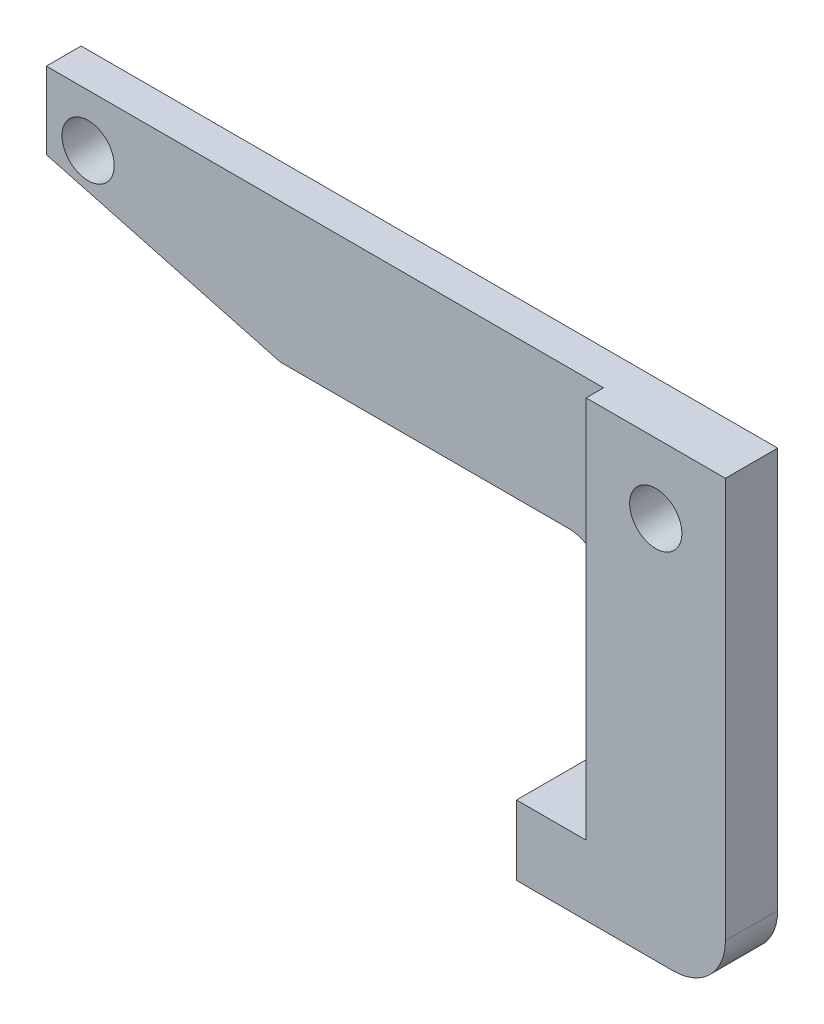
ISO-10303-21;
HEADER;
FILE_DESCRIPTION(('STEP AP214'),'2;1');
FILE_NAME('part.step','',(''),(''),'','','');
FILE_SCHEMA(('AUTOMOTIVE_DESIGN { 1 0 10303 214 1 1 1 1 }'));
ENDSEC;
DATA;
#1=APPLICATION_CONTEXT('core data for automotive mechanical design processes');
#2=APPLICATION_PROTOCOL_DEFINITION('international standard','automotive_design',2000,#1);
#3=PRODUCT_CONTEXT('',#1,'mechanical');
#4=PRODUCT('Part','Part','',(#3));
#5=PRODUCT_RELATED_PRODUCT_CATEGORY('part','',(#4));
#6=PRODUCT_DEFINITION_FORMATION('','',#4);
#7=PRODUCT_DEFINITION_CONTEXT('part definition',#1,'design');
#8=PRODUCT_DEFINITION('design','',#6,#7);
#9=PRODUCT_DEFINITION_SHAPE('','',#8);
#10=(LENGTH_UNIT() NAMED_UNIT(*) SI_UNIT(.MILLI.,.METRE.));
#11=(NAMED_UNIT(*) PLANE_ANGLE_UNIT() SI_UNIT($,.RADIAN.));
#12=(NAMED_UNIT(*) SI_UNIT($,.STERADIAN.) SOLID_ANGLE_UNIT());
#13=UNCERTAINTY_MEASURE_WITH_UNIT(LENGTH_MEASURE(1.E-05),#10,'distance_accuracy_value','');
#14=(GEOMETRIC_REPRESENTATION_CONTEXT(3) GLOBAL_UNCERTAINTY_ASSIGNED_CONTEXT((#13)) GLOBAL_UNIT_ASSIGNED_CONTEXT((#10,
#11,#12)) REPRESENTATION_CONTEXT('',''));
#15=CARTESIAN_POINT('',(0.,0.,0.));
#16=DIRECTION('',(0.,0.,1.));
#17=DIRECTION('',(1.,0.,0.));
#18=AXIS2_PLACEMENT_3D('',#15,#16,#17);
#19=CARTESIAN_POINT('',(-114.3,-12.7,0.));
#20=DIRECTION('',(0.,0.,1.));
#21=DIRECTION('',(1.,0.,0.));
#22=AXIS2_PLACEMENT_3D('',#19,#20,#21);
#23=PLANE('',#22);
#24=DIRECTION('',(0.,-1.,0.));
#25=VECTOR('',#24,1.);
#26=CARTESIAN_POINT('',(9.52499999999998,-12.7,0.));
#27=LINE('',#26,#25);
#28=CARTESIAN_POINT('',(9.52499999999999,9.52499999999999,0.));
#29=VERTEX_POINT('',#28);
#30=CARTESIAN_POINT('',(9.52499999999998,0.,0.));
#31=VERTEX_POINT('',#30);
#32=EDGE_CURVE('E155',#29,#31,#27,.T.);
#33=ORIENTED_EDGE('',*,*,#32,.T.);
#34=CARTESIAN_POINT('',(0.,0.,0.));
#35=DIRECTION('',(0.,0.,-1.));
#36=DIRECTION('',(-1.,0.,0.));
#37=AXIS2_PLACEMENT_3D('',#34,#35,#36);
#38=CIRCLE('',#37,9.525);
#39=CARTESIAN_POINT('',(0.,9.52499999999999,0.));
#40=VERTEX_POINT('',#39);
#41=EDGE_CURVE('E49',#40,#31,#38,.T.);
#42=ORIENTED_EDGE('',*,*,#41,.F.);
#43=DIRECTION('',(1.,0.,0.));
#44=VECTOR('',#43,1.);
#45=CARTESIAN_POINT('',(-114.3,9.52499999999999,0.));
#46=LINE('',#45,#44);
#47=EDGE_CURVE('E152',#40,#29,#46,.T.);
#48=ORIENTED_EDGE('',*,*,#47,.T.);
#49=EDGE_LOOP('',(#33,#42,#48));
#50=FACE_BOUND('',#49,.T.);
#51=ADVANCED_FACE('F33',(#50),#23,.F.);
#52=CARTESIAN_POINT('',(0.,0.,0.));
#53=DIRECTION('',(0.,0.,1.));
#54=DIRECTION('',(1.,0.,0.));
#55=AXIS2_PLACEMENT_3D('',#52,#53,#54);
#56=CYLINDRICAL_SURFACE('',#55,4.7625);
#57=CARTESIAN_POINT('',(0.,0.,12.7));
#58=DIRECTION('',(0.,0.,1.));
#59=DIRECTION('',(1.,0.,0.));
#60=AXIS2_PLACEMENT_3D('',#57,#58,#59);
#61=CIRCLE('',#60,4.7625);
#62=CARTESIAN_POINT('',(4.7625,0.,12.7));
#63=VERTEX_POINT('',#62);
#64=EDGE_CURVE('E211',#63,#63,#61,.T.);
#65=ORIENTED_EDGE('',*,*,#64,.T.);
#66=EDGE_LOOP('',(#65));
#67=FACE_BOUND('',#66,.T.);
#68=CARTESIAN_POINT('',(0.,0.,4.445));
#69=DIRECTION('',(0.,0.,-1.));
#70=DIRECTION('',(-1.,0.,0.));
#71=AXIS2_PLACEMENT_3D('',#68,#69,#70);
#72=CIRCLE('',#71,4.7625);
#73=CARTESIAN_POINT('',(-4.7625,0.,4.445));
#74=VERTEX_POINT('',#73);
#75=EDGE_CURVE('E37',#74,#74,#72,.F.);
#76=ORIENTED_EDGE('',*,*,#75,.F.);
#77=EDGE_LOOP('',(#76));
#78=FACE_BOUND('',#77,.T.);
#79=ADVANCED_FACE('F351',(#67,#78),#56,.F.);
#80=CARTESIAN_POINT('',(-114.3,12.7,12.7));
#81=DIRECTION('',(1.,0.,0.));
#82=DIRECTION('',(0.,0.,-1.));
#83=AXIS2_PLACEMENT_3D('',#80,#81,#82);
#84=PLANE('',#83);
#85=DIRECTION('',(0.,0.,-1.));
#86=VECTOR('',#85,1.);
#87=CARTESIAN_POINT('',(-114.3,12.7,12.7));
#88=LINE('',#87,#86);
#89=CARTESIAN_POINT('',(-114.3,12.7,9.525));
#90=VERTEX_POINT('',#89);
#91=CARTESIAN_POINT('',(-114.3,12.7,3.175));
#92=VERTEX_POINT('',#91);
#93=EDGE_CURVE('E229',#90,#92,#88,.T.);
#94=ORIENTED_EDGE('',*,*,#93,.T.);
#95=DIRECTION('',(0.,0.707106781186549,0.707106781186546));
#96=VECTOR('',#95,1.);
#97=CARTESIAN_POINT('',(-114.3,12.7,3.175));
#98=LINE('',#97,#96);
#99=CARTESIAN_POINT('',(-114.3,9.52499999999999,0.));
#100=VERTEX_POINT('',#99);
#101=EDGE_CURVE('E42',#92,#100,#98,.F.);
#102=ORIENTED_EDGE('',*,*,#101,.T.);
#103=DIRECTION('',(0.,-1.,0.));
#104=VECTOR('',#103,1.);
#105=CARTESIAN_POINT('',(-114.3,12.7,0.));
#106=LINE('',#105,#104);
#107=CARTESIAN_POINT('',(-114.3,-1.26999999999999,0.));
#108=VERTEX_POINT('',#107);
#109=EDGE_CURVE('E167',#100,#108,#106,.T.);
#110=ORIENTED_EDGE('',*,*,#109,.T.);
#111=DIRECTION('',(0.,0.,1.));
#112=VECTOR('',#111,1.);
#113=CARTESIAN_POINT('',(-114.3,-1.26999999999999,12.7));
#114=LINE('',#113,#112);
#115=CARTESIAN_POINT('',(-114.3,-1.26999999999999,9.525));
#116=VERTEX_POINT('',#115);
#117=EDGE_CURVE('E256',#108,#116,#114,.T.);
#118=ORIENTED_EDGE('',*,*,#117,.T.);
#119=DIRECTION('',(0.,-1.,0.));
#120=VECTOR('',#119,1.);
#121=CARTESIAN_POINT('',(-114.3,-12.7,9.525));
#122=LINE('',#121,#120);
#123=EDGE_CURVE('E194',#90,#116,#122,.T.);
#124=ORIENTED_EDGE('',*,*,#123,.F.);
#125=EDGE_LOOP('',(#94,#102,#110,#118,#124));
#126=FACE_BOUND('',#125,.T.);
#127=ADVANCED_FACE('F326',(#126),#84,.F.);
#128=CARTESIAN_POINT('',(-114.3,-12.7,12.7));
#129=DIRECTION('',(0.,1.,0.));
#130=DIRECTION('',(0.,0.,1.));
#131=AXIS2_PLACEMENT_3D('',#128,#129,#130);
#132=PLANE('',#131);
#133=DIRECTION('',(1.,0.,0.));
#134=VECTOR('',#133,1.);
#135=CARTESIAN_POINT('',(-114.3,-12.7,0.));
#136=LINE('',#135,#134);
#137=CARTESIAN_POINT('',(-71.6426592694879,-12.7,0.));
#138=VERTEX_POINT('',#137);
#139=CARTESIAN_POINT('',(-19.05,-12.7,0.));
#140=VERTEX_POINT('',#139);
#141=EDGE_CURVE('E231',#138,#140,#136,.T.);
#142=ORIENTED_EDGE('',*,*,#141,.T.);
#143=DIRECTION('',(0.,0.,-1.));
#144=VECTOR('',#143,1.);
#145=CARTESIAN_POINT('',(-19.05,-12.7,9.525));
#146=LINE('',#145,#144);
#147=CARTESIAN_POINT('',(-19.05,-12.7,9.525));
#148=VERTEX_POINT('',#147);
#149=EDGE_CURVE('E272',#140,#148,#146,.F.);
#150=ORIENTED_EDGE('',*,*,#149,.T.);
#151=DIRECTION('',(1.,0.,0.));
#152=VECTOR('',#151,1.);
#153=CARTESIAN_POINT('',(-12.7,-12.7,9.525));
#154=LINE('',#153,#152);
#155=CARTESIAN_POINT('',(-71.642659269488,-12.7,9.525));
#156=VERTEX_POINT('',#155);
#157=EDGE_CURVE('E199',#156,#148,#154,.T.);
#158=ORIENTED_EDGE('',*,*,#157,.F.);
#159=DIRECTION('',(0.,0.,-1.));
#160=VECTOR('',#159,1.);
#161=CARTESIAN_POINT('',(-71.6426592694879,-12.7,12.7));
#162=LINE('',#161,#160);
#163=EDGE_CURVE('E252',#156,#138,#162,.T.);
#164=ORIENTED_EDGE('',*,*,#163,.T.);
#165=EDGE_LOOP('',(#142,#150,#158,#164));
#166=FACE_BOUND('',#165,.T.);
#167=ADVANCED_FACE('F316',(#166),#132,.F.);
#168=CARTESIAN_POINT('',(-106.68,3.175,0.));
#169=DIRECTION('',(0.,0.,1.));
#170=DIRECTION('',(1.,0.,0.));
#171=AXIS2_PLACEMENT_3D('',#168,#169,#170);
#172=CYLINDRICAL_SURFACE('',#171,4.7625);
#173=CARTESIAN_POINT('',(-106.68,3.175,0.));
#174=DIRECTION('',(0.,0.,1.));
#175=DIRECTION('',(1.,0.,0.));
#176=AXIS2_PLACEMENT_3D('',#173,#174,#175);
#177=CIRCLE('',#176,4.7625);
#178=CARTESIAN_POINT('',(-101.9175,3.175,0.));
#179=VERTEX_POINT('',#178);
#180=EDGE_CURVE('E208',#179,#179,#177,.T.);
#181=ORIENTED_EDGE('',*,*,#180,.F.);
#182=EDGE_LOOP('',(#181));
#183=FACE_BOUND('',#182,.T.);
#184=CARTESIAN_POINT('',(-106.68,3.175,9.525));
#185=DIRECTION('',(0.,0.,1.));
#186=DIRECTION('',(1.,0.,0.));
#187=AXIS2_PLACEMENT_3D('',#184,#185,#186);
#188=CIRCLE('',#187,4.7625);
#189=CARTESIAN_POINT('',(-101.9175,3.175,9.525));
#190=VERTEX_POINT('',#189);
#191=EDGE_CURVE('E205',#190,#190,#188,.F.);
#192=ORIENTED_EDGE('',*,*,#191,.F.);
#193=EDGE_LOOP('',(#192));
#194=FACE_BOUND('',#193,.T.);
#195=ADVANCED_FACE('F369',(#183,#194),#172,.F.);
#196=CARTESIAN_POINT('',(-71.6426592694879,-12.7,12.7));
#197=DIRECTION('',(0.258819045102522,0.965925826289068,0.));
#198=DIRECTION('',(-0.965925826289068,0.258819045102522,0.));
#199=AXIS2_PLACEMENT_3D('',#196,#197,#198);
#200=PLANE('',#199);
#201=ORIENTED_EDGE('',*,*,#163,.F.);
#202=DIRECTION('',(0.965925826289068,-0.258819045102522,0.));
#203=VECTOR('',#202,1.);
#204=CARTESIAN_POINT('',(-71.6426592694879,-12.7,9.525));
#205=LINE('',#204,#203);
#206=EDGE_CURVE('E259',#156,#116,#205,.F.);
#207=ORIENTED_EDGE('',*,*,#206,.T.);
#208=ORIENTED_EDGE('',*,*,#117,.F.);
#209=DIRECTION('',(0.965925826289068,-0.258819045102522,0.));
#210=VECTOR('',#209,1.);
#211=CARTESIAN_POINT('',(-71.6426592694879,-12.7,0.));
#212=LINE('',#211,#210);
#213=EDGE_CURVE('E254',#138,#108,#212,.F.);
#214=ORIENTED_EDGE('',*,*,#213,.F.);
#215=EDGE_LOOP('',(#201,#207,#208,#214));
#216=FACE_BOUND('',#215,.T.);
#217=ADVANCED_FACE('F323',(#216),#200,.F.);
#218=CARTESIAN_POINT('',(-12.7,-12.7,12.7));
#219=DIRECTION('',(1.,0.,0.));
#220=DIRECTION('',(0.,1.,0.));
#221=AXIS2_PLACEMENT_3D('',#218,#219,#220);
#222=PLANE('',#221);
#223=DIRECTION('',(0.,1.,0.));
#224=VECTOR('',#223,1.);
#225=CARTESIAN_POINT('',(-12.7,-12.7,9.525));
#226=LINE('',#225,#224);
#227=CARTESIAN_POINT('',(-12.7,-19.05,9.525));
#228=VERTEX_POINT('',#227);
#229=CARTESIAN_POINT('',(-12.7,12.7,9.525));
#230=VERTEX_POINT('',#229);
#231=EDGE_CURVE('E185',#228,#230,#226,.T.);
#232=ORIENTED_EDGE('',*,*,#231,.F.);
#233=DIRECTION('',(0.,0.,-1.));
#234=VECTOR('',#233,1.);
#235=CARTESIAN_POINT('',(-12.7,-19.05,0.));
#236=LINE('',#235,#234);
#237=CARTESIAN_POINT('',(-12.7,-19.05,0.));
#238=VERTEX_POINT('',#237);
#239=EDGE_CURVE('E269',#228,#238,#236,.T.);
#240=ORIENTED_EDGE('',*,*,#239,.T.);
#241=DIRECTION('',(0.,-1.,0.));
#242=VECTOR('',#241,1.);
#243=CARTESIAN_POINT('',(-12.7,-12.7,0.));
#244=LINE('',#243,#242);
#245=CARTESIAN_POINT('',(-12.7,-57.15,0.));
#246=VERTEX_POINT('',#245);
#247=EDGE_CURVE('E234',#238,#246,#244,.T.);
#248=ORIENTED_EDGE('',*,*,#247,.T.);
#249=DIRECTION('',(0.,0.,-1.));
#250=VECTOR('',#249,1.);
#251=CARTESIAN_POINT('',(-12.7,-57.15,12.7));
#252=LINE('',#251,#250);
#253=CARTESIAN_POINT('',(-12.7,-57.15,12.7));
#254=VERTEX_POINT('',#253);
#255=EDGE_CURVE('E249',#254,#246,#252,.T.);
#256=ORIENTED_EDGE('',*,*,#255,.F.);
#257=DIRECTION('',(0.,-1.,0.));
#258=VECTOR('',#257,1.);
#259=CARTESIAN_POINT('',(-12.7,-12.7,12.7));
#260=LINE('',#259,#258);
#261=CARTESIAN_POINT('',(-12.7,12.7,12.7));
#262=VERTEX_POINT('',#261);
#263=EDGE_CURVE('E214',#262,#254,#260,.T.);
#264=ORIENTED_EDGE('',*,*,#263,.F.);
#265=DIRECTION('',(0.,0.,1.));
#266=VECTOR('',#265,1.);
#267=CARTESIAN_POINT('',(-12.7,12.7,9.525));
#268=LINE('',#267,#266);
#269=EDGE_CURVE('E202',#230,#262,#268,.T.);
#270=ORIENTED_EDGE('',*,*,#269,.F.);
#271=EDGE_LOOP('',(#232,#240,#248,#256,#264,#270));
#272=FACE_BOUND('',#271,.T.);
#273=ADVANCED_FACE('F308',(#272),#222,.F.);
#274=CARTESIAN_POINT('',(-12.7,-57.15,12.7));
#275=DIRECTION('',(0.,-1.,0.));
#276=DIRECTION('',(0.,0.,-1.));
#277=AXIS2_PLACEMENT_3D('',#274,#275,#276);
#278=PLANE('',#277);
#279=DIRECTION('',(-1.,0.,0.));
#280=VECTOR('',#279,1.);
#281=CARTESIAN_POINT('',(-12.7,-57.15,0.));
#282=LINE('',#281,#280);
#283=CARTESIAN_POINT('',(-25.4,-57.15,0.));
#284=VERTEX_POINT('',#283);
#285=EDGE_CURVE('E236',#246,#284,#282,.T.);
#286=ORIENTED_EDGE('',*,*,#285,.T.);
#287=DIRECTION('',(0.,0.,-1.));
#288=VECTOR('',#287,1.);
#289=CARTESIAN_POINT('',(-25.4,-57.15,12.7));
#290=LINE('',#289,#288);
#291=CARTESIAN_POINT('',(-25.4,-57.15,12.7));
#292=VERTEX_POINT('',#291);
#293=EDGE_CURVE('E246',#292,#284,#290,.T.);
#294=ORIENTED_EDGE('',*,*,#293,.F.);
#295=DIRECTION('',(-1.,0.,0.));
#296=VECTOR('',#295,1.);
#297=CARTESIAN_POINT('',(-12.7,-57.15,12.7));
#298=LINE('',#297,#296);
#299=EDGE_CURVE('E216',#254,#292,#298,.T.);
#300=ORIENTED_EDGE('',*,*,#299,.F.);
#301=ORIENTED_EDGE('',*,*,#255,.T.);
#302=EDGE_LOOP('',(#286,#294,#300,#301));
#303=FACE_BOUND('',#302,.T.);
#304=ADVANCED_FACE('F303',(#303),#278,.F.);
#305=CARTESIAN_POINT('',(-25.4,-57.15,12.7));
#306=DIRECTION('',(1.,0.,0.));
#307=DIRECTION('',(0.,1.,0.));
#308=AXIS2_PLACEMENT_3D('',#305,#306,#307);
#309=PLANE('',#308);
#310=DIRECTION('',(0.,-1.,0.));
#311=VECTOR('',#310,1.);
#312=CARTESIAN_POINT('',(-25.4,-57.15,0.));
#313=LINE('',#312,#311);
#314=CARTESIAN_POINT('',(-25.4,-66.675,0.));
#315=VERTEX_POINT('',#314);
#316=EDGE_CURVE('E217',#284,#315,#313,.T.);
#317=ORIENTED_EDGE('',*,*,#316,.T.);
#318=DIRECTION('',(0.,0.707106781186549,-0.707106781186546));
#319=VECTOR('',#318,1.);
#320=CARTESIAN_POINT('',(-25.4,-69.85,3.175));
#321=LINE('',#320,#319);
#322=CARTESIAN_POINT('',(-25.4,-69.85,3.175));
#323=VERTEX_POINT('',#322);
#324=EDGE_CURVE('E175',#315,#323,#321,.F.);
#325=ORIENTED_EDGE('',*,*,#324,.T.);
#326=DIRECTION('',(0.,0.,-1.));
#327=VECTOR('',#326,1.);
#328=CARTESIAN_POINT('',(-25.4,-69.85,12.7));
#329=LINE('',#328,#327);
#330=CARTESIAN_POINT('',(-25.4,-69.85,12.7));
#331=VERTEX_POINT('',#330);
#332=EDGE_CURVE('E243',#331,#323,#329,.T.);
#333=ORIENTED_EDGE('',*,*,#332,.F.);
#334=DIRECTION('',(0.,-1.,0.));
#335=VECTOR('',#334,1.);
#336=CARTESIAN_POINT('',(-25.4,-57.15,12.7));
#337=LINE('',#336,#335);
#338=EDGE_CURVE('E219',#292,#331,#337,.T.);
#339=ORIENTED_EDGE('',*,*,#338,.F.);
#340=ORIENTED_EDGE('',*,*,#293,.T.);
#341=EDGE_LOOP('',(#317,#325,#333,#339,#340));
#342=FACE_BOUND('',#341,.T.);
#343=ADVANCED_FACE('F297',(#342),#309,.F.);
#344=CARTESIAN_POINT('',(12.7,-69.85,12.7));
#345=DIRECTION('',(0.,1.,0.));
#346=DIRECTION('',(-1.,0.,0.));
#347=AXIS2_PLACEMENT_3D('',#344,#345,#346);
#348=PLANE('',#347);
#349=ORIENTED_EDGE('',*,*,#332,.T.);
#350=DIRECTION('',(1.,0.,0.));
#351=VECTOR('',#350,1.);
#352=CARTESIAN_POINT('',(12.7,-69.85,3.175));
#353=LINE('',#352,#351);
#354=CARTESIAN_POINT('',(3.17500000000001,-69.85,3.175));
#355=VERTEX_POINT('',#354);
#356=EDGE_CURVE('E277',#323,#355,#353,.T.);
#357=ORIENTED_EDGE('',*,*,#356,.T.);
#358=DIRECTION('',(0.,0.,-1.));
#359=VECTOR('',#358,1.);
#360=CARTESIAN_POINT('',(3.17500000000001,-69.85,12.7));
#361=LINE('',#360,#359);
#362=CARTESIAN_POINT('',(3.17500000000001,-69.85,12.7));
#363=VERTEX_POINT('',#362);
#364=EDGE_CURVE('E265',#355,#363,#361,.F.);
#365=ORIENTED_EDGE('',*,*,#364,.T.);
#366=DIRECTION('',(1.,0.,0.));
#367=VECTOR('',#366,1.);
#368=CARTESIAN_POINT('',(12.7,-69.85,12.7));
#369=LINE('',#368,#367);
#370=EDGE_CURVE('E221',#331,#363,#369,.T.);
#371=ORIENTED_EDGE('',*,*,#370,.F.);
#372=EDGE_LOOP('',(#349,#357,#365,#371));
#373=FACE_BOUND('',#372,.T.);
#374=ADVANCED_FACE('F341',(#373),#348,.F.);
#375=CARTESIAN_POINT('',(12.7,12.7,12.7));
#376=DIRECTION('',(-1.,0.,0.));
#377=DIRECTION('',(0.,-1.,0.));
#378=AXIS2_PLACEMENT_3D('',#375,#376,#377);
#379=PLANE('',#378);
#380=DIRECTION('',(0.,0.,-1.));
#381=VECTOR('',#380,1.);
#382=CARTESIAN_POINT('',(12.7,-60.325,12.7));
#383=LINE('',#382,#381);
#384=CARTESIAN_POINT('',(12.7,-60.325,12.7));
#385=VERTEX_POINT('',#384);
#386=CARTESIAN_POINT('',(12.7,-60.325,3.175));
#387=VERTEX_POINT('',#386);
#388=EDGE_CURVE('E262',#385,#387,#383,.T.);
#389=ORIENTED_EDGE('',*,*,#388,.T.);
#390=DIRECTION('',(0.,1.,0.));
#391=VECTOR('',#390,1.);
#392=CARTESIAN_POINT('',(12.7,12.7,3.175));
#393=LINE('',#392,#391);
#394=CARTESIAN_POINT('',(12.7,12.7,3.175));
#395=VERTEX_POINT('',#394);
#396=EDGE_CURVE('E11',#387,#395,#393,.T.);
#397=ORIENTED_EDGE('',*,*,#396,.T.);
#398=DIRECTION('',(0.,0.,-1.));
#399=VECTOR('',#398,1.);
#400=CARTESIAN_POINT('',(12.7,12.7,12.7));
#401=LINE('',#400,#399);
#402=CARTESIAN_POINT('',(12.7,12.7,12.7));
#403=VERTEX_POINT('',#402);
#404=EDGE_CURVE('E241',#403,#395,#401,.T.);
#405=ORIENTED_EDGE('',*,*,#404,.F.);
#406=DIRECTION('',(0.,1.,0.));
#407=VECTOR('',#406,1.);
#408=CARTESIAN_POINT('',(12.7,12.7,12.7));
#409=LINE('',#408,#407);
#410=EDGE_CURVE('E224',#385,#403,#409,.T.);
#411=ORIENTED_EDGE('',*,*,#410,.F.);
#412=EDGE_LOOP('',(#389,#397,#405,#411));
#413=FACE_BOUND('',#412,.T.);
#414=ADVANCED_FACE('F337',(#413),#379,.F.);
#415=CARTESIAN_POINT('',(-114.3,12.7,12.7));
#416=DIRECTION('',(0.,-1.,0.));
#417=DIRECTION('',(0.,0.,-1.));
#418=AXIS2_PLACEMENT_3D('',#415,#416,#417);
#419=PLANE('',#418);
#420=ORIENTED_EDGE('',*,*,#404,.T.);
#421=DIRECTION('',(-1.,0.,0.));
#422=VECTOR('',#421,1.);
#423=CARTESIAN_POINT('',(-114.3,12.7,3.175));
#424=LINE('',#423,#422);
#425=EDGE_CURVE('E57',#395,#92,#424,.T.);
#426=ORIENTED_EDGE('',*,*,#425,.T.);
#427=ORIENTED_EDGE('',*,*,#93,.F.);
#428=DIRECTION('',(-1.,0.,0.));
#429=VECTOR('',#428,1.);
#430=CARTESIAN_POINT('',(-12.7,12.7,9.525));
#431=LINE('',#430,#429);
#432=EDGE_CURVE('E189',#230,#90,#431,.T.);
#433=ORIENTED_EDGE('',*,*,#432,.F.);
#434=ORIENTED_EDGE('',*,*,#269,.T.);
#435=DIRECTION('',(-1.,0.,0.));
#436=VECTOR('',#435,1.);
#437=CARTESIAN_POINT('',(-114.3,12.7,12.7));
#438=LINE('',#437,#436);
#439=EDGE_CURVE('E226',#403,#262,#438,.T.);
#440=ORIENTED_EDGE('',*,*,#439,.F.);
#441=EDGE_LOOP('',(#420,#426,#427,#433,#434,#440));
#442=FACE_BOUND('',#441,.T.);
#443=ADVANCED_FACE('F327',(#442),#419,.F.);
#444=CARTESIAN_POINT('',(-114.3,-12.7,12.7));
#445=DIRECTION('',(0.,0.,1.));
#446=DIRECTION('',(1.,0.,0.));
#447=AXIS2_PLACEMENT_3D('',#444,#445,#446);
#448=PLANE('',#447);
#449=ORIENTED_EDGE('',*,*,#370,.T.);
#450=CARTESIAN_POINT('',(3.17500000000001,-60.325,12.7));
#451=DIRECTION('',(0.,0.,1.));
#452=DIRECTION('',(1.,0.,0.));
#453=AXIS2_PLACEMENT_3D('',#450,#451,#452);
#454=CIRCLE('',#453,9.525);
#455=EDGE_CURVE('E267',#363,#385,#454,.T.);
#456=ORIENTED_EDGE('',*,*,#455,.T.);
#457=ORIENTED_EDGE('',*,*,#410,.T.);
#458=ORIENTED_EDGE('',*,*,#439,.T.);
#459=ORIENTED_EDGE('',*,*,#263,.T.);
#460=ORIENTED_EDGE('',*,*,#299,.T.);
#461=ORIENTED_EDGE('',*,*,#338,.T.);
#462=EDGE_LOOP('',(#449,#456,#457,#458,#459,#460,#461));
#463=FACE_BOUND('',#462,.T.);
#464=ORIENTED_EDGE('',*,*,#64,.F.);
#465=EDGE_LOOP('',(#464));
#466=FACE_BOUND('',#465,.T.);
#467=ADVANCED_FACE('F330',(#463,#466),#448,.T.);
#468=ORIENTED_EDGE('',*,*,#180,.T.);
#469=EDGE_LOOP('',(#468));
#470=FACE_BOUND('',#469,.T.);
#471=EDGE_CURVE('E160',#100,#40,#46,.T.);
#472=ORIENTED_EDGE('',*,*,#471,.T.);
#473=EDGE_CURVE('E143',#31,#40,#38,.T.);
#474=ORIENTED_EDGE('',*,*,#473,.F.);
#475=CARTESIAN_POINT('',(9.525,-60.325,0.));
#476=VERTEX_POINT('',#475);
#477=EDGE_CURVE('E279',#31,#476,#27,.T.);
#478=ORIENTED_EDGE('',*,*,#477,.T.);
#479=CARTESIAN_POINT('',(3.17500000000001,-60.325,0.));
#480=DIRECTION('',(0.,0.,1.));
#481=DIRECTION('',(1.,0.,0.));
#482=AXIS2_PLACEMENT_3D('',#479,#480,#481);
#483=CIRCLE('',#482,6.34999999999999);
#484=CARTESIAN_POINT('',(3.17500000000001,-66.675,0.));
#485=VERTEX_POINT('',#484);
#486=EDGE_CURVE('E168',#476,#485,#483,.F.);
#487=ORIENTED_EDGE('',*,*,#486,.T.);
#488=DIRECTION('',(-1.,0.,0.));
#489=VECTOR('',#488,1.);
#490=CARTESIAN_POINT('',(-114.3,-66.675,0.));
#491=LINE('',#490,#489);
#492=EDGE_CURVE('E169',#485,#315,#491,.T.);
#493=ORIENTED_EDGE('',*,*,#492,.T.);
#494=ORIENTED_EDGE('',*,*,#316,.F.);
#495=ORIENTED_EDGE('',*,*,#285,.F.);
#496=ORIENTED_EDGE('',*,*,#247,.F.);
#497=CARTESIAN_POINT('',(-19.05,-19.05,0.));
#498=DIRECTION('',(0.,0.,1.));
#499=DIRECTION('',(1.,0.,0.));
#500=AXIS2_PLACEMENT_3D('',#497,#498,#499);
#501=CIRCLE('',#500,6.35);
#502=EDGE_CURVE('E274',#238,#140,#501,.T.);
#503=ORIENTED_EDGE('',*,*,#502,.T.);
#504=ORIENTED_EDGE('',*,*,#141,.F.);
#505=ORIENTED_EDGE('',*,*,#213,.T.);
#506=ORIENTED_EDGE('',*,*,#109,.F.);
#507=EDGE_LOOP('',(#472,#474,#478,#487,#493,#494,#495,#496,#503,#504,#505,#506));
#508=FACE_BOUND('',#507,.T.);
#509=ADVANCED_FACE('F165',(#470,#508),#23,.F.);
#510=CARTESIAN_POINT('',(-12.7,12.7,9.525));
#511=DIRECTION('',(0.,0.,1.));
#512=DIRECTION('',(1.,0.,0.));
#513=AXIS2_PLACEMENT_3D('',#510,#511,#512);
#514=PLANE('',#513);
#515=ORIENTED_EDGE('',*,*,#157,.T.);
#516=CARTESIAN_POINT('',(-19.05,-19.05,9.525));
#517=DIRECTION('',(0.,0.,1.));
#518=DIRECTION('',(1.,0.,0.));
#519=AXIS2_PLACEMENT_3D('',#516,#517,#518);
#520=CIRCLE('',#519,6.35);
#521=EDGE_CURVE('E276',#148,#228,#520,.F.);
#522=ORIENTED_EDGE('',*,*,#521,.T.);
#523=ORIENTED_EDGE('',*,*,#231,.T.);
#524=ORIENTED_EDGE('',*,*,#432,.T.);
#525=ORIENTED_EDGE('',*,*,#123,.T.);
#526=ORIENTED_EDGE('',*,*,#206,.F.);
#527=EDGE_LOOP('',(#515,#522,#523,#524,#525,#526));
#528=FACE_BOUND('',#527,.T.);
#529=ORIENTED_EDGE('',*,*,#191,.T.);
#530=EDGE_LOOP('',(#529));
#531=FACE_BOUND('',#530,.T.);
#532=ADVANCED_FACE('F318',(#528,#531),#514,.T.);
#533=CARTESIAN_POINT('',(3.17500000000001,-60.325,12.7));
#534=DIRECTION('',(0.,0.,-1.));
#535=DIRECTION('',(-1.,0.,0.));
#536=AXIS2_PLACEMENT_3D('',#533,#534,#535);
#537=CYLINDRICAL_SURFACE('',#536,9.525);
#538=ORIENTED_EDGE('',*,*,#364,.F.);
#539=CARTESIAN_POINT('',(3.17500000000001,-60.325,3.175));
#540=DIRECTION('',(0.,0.,1.));
#541=DIRECTION('',(1.,0.,0.));
#542=AXIS2_PLACEMENT_3D('',#539,#540,#541);
#543=CIRCLE('',#542,9.525);
#544=EDGE_CURVE('E177',#355,#387,#543,.T.);
#545=ORIENTED_EDGE('',*,*,#544,.T.);
#546=ORIENTED_EDGE('',*,*,#388,.F.);
#547=ORIENTED_EDGE('',*,*,#455,.F.);
#548=EDGE_LOOP('',(#538,#545,#546,#547));
#549=FACE_BOUND('',#548,.T.);
#550=ADVANCED_FACE('F339',(#549),#537,.T.);
#551=CARTESIAN_POINT('',(-19.05,-19.05,12.7));
#552=DIRECTION('',(0.,0.,1.));
#553=DIRECTION('',(1.,0.,0.));
#554=AXIS2_PLACEMENT_3D('',#551,#552,#553);
#555=CYLINDRICAL_SURFACE('',#554,6.35);
#556=ORIENTED_EDGE('',*,*,#521,.F.);
#557=ORIENTED_EDGE('',*,*,#149,.F.);
#558=ORIENTED_EDGE('',*,*,#502,.F.);
#559=ORIENTED_EDGE('',*,*,#239,.F.);
#560=EDGE_LOOP('',(#556,#557,#558,#559));
#561=FACE_BOUND('',#560,.T.);
#562=ADVANCED_FACE('F312',(#561),#555,.F.);
#563=CARTESIAN_POINT('',(-114.3,12.7,3.175));
#564=DIRECTION('',(0.,-0.707106781186546,0.707106781186549));
#565=DIRECTION('',(0.,-0.707106781186549,-0.707106781186546));
#566=AXIS2_PLACEMENT_3D('',#563,#564,#565);
#567=PLANE('',#566);
#568=ORIENTED_EDGE('',*,*,#101,.F.);
#569=ORIENTED_EDGE('',*,*,#425,.F.);
#570=DIRECTION('',(0.577350269189626,0.577350269189627,0.577350269189625));
#571=VECTOR('',#570,1.);
#572=CARTESIAN_POINT('',(12.7,12.7,3.175));
#573=LINE('',#572,#571);
#574=EDGE_CURVE('E162',#29,#395,#573,.T.);
#575=ORIENTED_EDGE('',*,*,#574,.F.);
#576=ORIENTED_EDGE('',*,*,#47,.F.);
#577=ORIENTED_EDGE('',*,*,#471,.F.);
#578=EDGE_LOOP('',(#568,#569,#575,#576,#577));
#579=FACE_BOUND('',#578,.T.);
#580=ADVANCED_FACE('F35',(#579),#567,.F.);
#581=CARTESIAN_POINT('',(12.7,12.7,3.175));
#582=DIRECTION('',(-0.707106781186546,0.,0.707106781186548));
#583=DIRECTION('',(0.707106781186549,0.,0.707106781186547));
#584=AXIS2_PLACEMENT_3D('',#581,#582,#583);
#585=PLANE('',#584);
#586=ORIENTED_EDGE('',*,*,#574,.T.);
#587=ORIENTED_EDGE('',*,*,#396,.F.);
#588=DIRECTION('',(0.707106781186549,0.,0.707106781186547));
#589=VECTOR('',#588,1.);
#590=CARTESIAN_POINT('',(9.525,-60.325,0.));
#591=LINE('',#590,#589);
#592=EDGE_CURVE('E183',#476,#387,#591,.T.);
#593=ORIENTED_EDGE('',*,*,#592,.F.);
#594=ORIENTED_EDGE('',*,*,#477,.F.);
#595=ORIENTED_EDGE('',*,*,#32,.F.);
#596=EDGE_LOOP('',(#586,#587,#593,#594,#595));
#597=FACE_BOUND('',#596,.T.);
#598=ADVANCED_FACE('F286',(#597),#585,.F.);
#599=CARTESIAN_POINT('',(3.17500000000001,-60.325,0.));
#600=DIRECTION('',(0.,0.,1.));
#601=DIRECTION('',(1.,0.,0.));
#602=AXIS2_PLACEMENT_3D('',#599,#600,#601);
#603=CONICAL_SURFACE('',#602,6.34999999999999,0.78539816339745);
#604=ORIENTED_EDGE('',*,*,#592,.T.);
#605=ORIENTED_EDGE('',*,*,#544,.F.);
#606=DIRECTION('',(0.,-0.707106781186549,0.707106781186546));
#607=VECTOR('',#606,1.);
#608=CARTESIAN_POINT('',(3.17500000000001,-66.675,0.));
#609=LINE('',#608,#607);
#610=EDGE_CURVE('E181',#485,#355,#609,.T.);
#611=ORIENTED_EDGE('',*,*,#610,.F.);
#612=ORIENTED_EDGE('',*,*,#486,.F.);
#613=EDGE_LOOP('',(#604,#605,#611,#612));
#614=FACE_BOUND('',#613,.T.);
#615=ADVANCED_FACE('F290',(#614),#603,.T.);
#616=CARTESIAN_POINT('',(12.7,-69.85,3.175));
#617=DIRECTION('',(0.,0.707106781186546,0.707106781186549));
#618=DIRECTION('',(0.,-0.707106781186549,0.707106781186546));
#619=AXIS2_PLACEMENT_3D('',#616,#617,#618);
#620=PLANE('',#619);
#621=ORIENTED_EDGE('',*,*,#324,.F.);
#622=ORIENTED_EDGE('',*,*,#492,.F.);
#623=ORIENTED_EDGE('',*,*,#610,.T.);
#624=ORIENTED_EDGE('',*,*,#356,.F.);
#625=EDGE_LOOP('',(#621,#622,#623,#624));
#626=FACE_BOUND('',#625,.T.);
#627=ADVANCED_FACE('F293',(#626),#620,.F.);
#628=CARTESIAN_POINT('',(0.,0.,4.445));
#629=DIRECTION('',(0.,0.,-1.));
#630=DIRECTION('',(-1.,0.,0.));
#631=AXIS2_PLACEMENT_3D('',#628,#629,#630);
#632=PLANE('',#631);
#633=CARTESIAN_POINT('',(0.,0.,4.445));
#634=DIRECTION('',(0.,0.,-1.));
#635=DIRECTION('',(-1.,0.,0.));
#636=AXIS2_PLACEMENT_3D('',#633,#634,#635);
#637=CIRCLE('',#636,9.525);
#638=CARTESIAN_POINT('',(-9.525,0.,4.445));
#639=VERTEX_POINT('',#638);
#640=EDGE_CURVE('E156',#639,#639,#637,.T.);
#641=ORIENTED_EDGE('',*,*,#640,.T.);
#642=EDGE_LOOP('',(#641));
#643=FACE_BOUND('',#642,.T.);
#644=ORIENTED_EDGE('',*,*,#75,.T.);
#645=EDGE_LOOP('',(#644));
#646=FACE_BOUND('',#645,.T.);
#647=ADVANCED_FACE('F383',(#643,#646),#632,.T.);
#648=CARTESIAN_POINT('',(0.,0.,4.445));
#649=DIRECTION('',(0.,0.,-1.));
#650=DIRECTION('',(-1.,0.,0.));
#651=AXIS2_PLACEMENT_3D('',#648,#649,#650);
#652=CYLINDRICAL_SURFACE('',#651,9.525);
#653=ORIENTED_EDGE('',*,*,#640,.F.);
#654=EDGE_LOOP('',(#653));
#655=FACE_BOUND('',#654,.T.);
#656=ORIENTED_EDGE('',*,*,#41,.T.);
#657=ORIENTED_EDGE('',*,*,#473,.T.);
#658=EDGE_LOOP('',(#656,#657));
#659=FACE_BOUND('',#658,.T.);
#660=ADVANCED_FACE('F144',(#655,#659),#652,.F.);
#661=CLOSED_SHELL('',(#51,#79,#127,#167,#195,#217,#273,#304,#343,#374,#414,#443,#467,#509,#532,
#550,#562,#580,#598,#615,#627,#647,#660));
#662=MANIFOLD_SOLID_BREP('B2',#661);
#663=ADVANCED_BREP_SHAPE_REPRESENTATION('',(#18,#662),#14);
#664=SHAPE_DEFINITION_REPRESENTATION(#9,#663);
ENDSEC;
END-ISO-10303-21;
